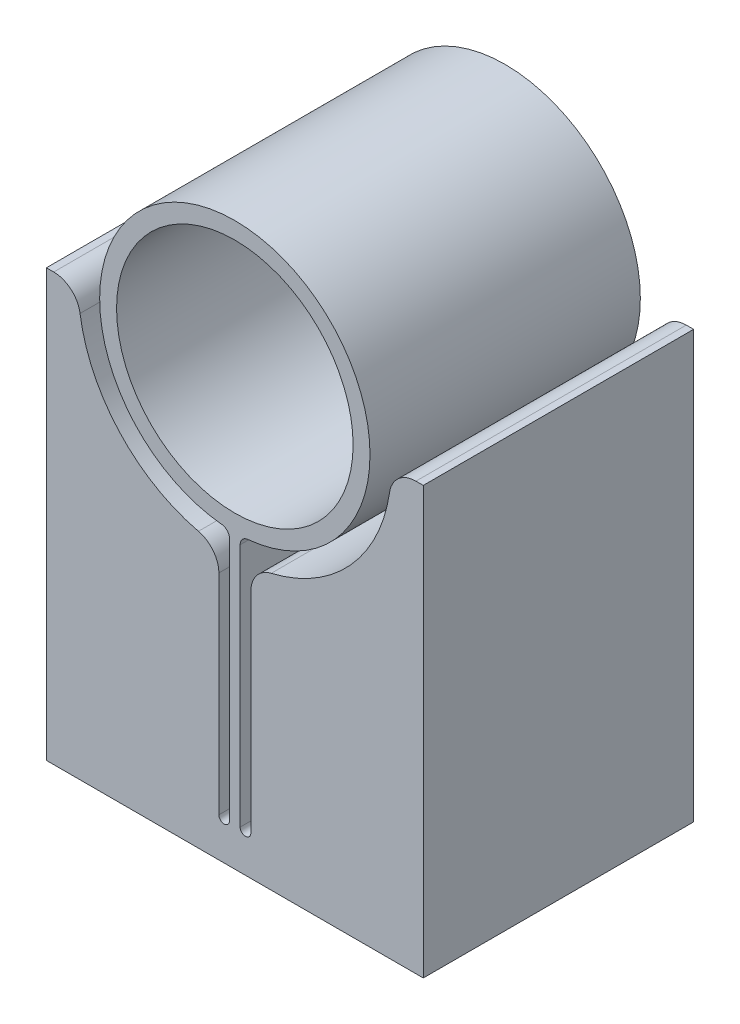
ISO-10303-21;
HEADER;
FILE_DESCRIPTION(('STEP AP214'),'2;1');
FILE_NAME('part.step','',(''),(''),'','','');
FILE_SCHEMA(('AUTOMOTIVE_DESIGN { 1 0 10303 214 1 1 1 1 }'));
ENDSEC;
DATA;
#1=APPLICATION_CONTEXT('core data for automotive mechanical design processes');
#2=APPLICATION_PROTOCOL_DEFINITION('international standard','automotive_design',2000,#1);
#3=PRODUCT_CONTEXT('',#1,'mechanical');
#4=PRODUCT('Part','Part','',(#3));
#5=PRODUCT_RELATED_PRODUCT_CATEGORY('part','',(#4));
#6=PRODUCT_DEFINITION_FORMATION('','',#4);
#7=PRODUCT_DEFINITION_CONTEXT('part definition',#1,'design');
#8=PRODUCT_DEFINITION('design','',#6,#7);
#9=PRODUCT_DEFINITION_SHAPE('','',#8);
#10=(LENGTH_UNIT() NAMED_UNIT(*) SI_UNIT(.MILLI.,.METRE.));
#11=(NAMED_UNIT(*) PLANE_ANGLE_UNIT() SI_UNIT($,.RADIAN.));
#12=(NAMED_UNIT(*) SI_UNIT($,.STERADIAN.) SOLID_ANGLE_UNIT());
#13=UNCERTAINTY_MEASURE_WITH_UNIT(LENGTH_MEASURE(1.E-05),#10,'distance_accuracy_value','');
#14=(GEOMETRIC_REPRESENTATION_CONTEXT(3) GLOBAL_UNCERTAINTY_ASSIGNED_CONTEXT((#13)) GLOBAL_UNIT_ASSIGNED_CONTEXT((#10,
#11,#12)) REPRESENTATION_CONTEXT('',''));
#15=CARTESIAN_POINT('',(0.,0.,0.));
#16=DIRECTION('',(0.,0.,1.));
#17=DIRECTION('',(1.,0.,0.));
#18=AXIS2_PLACEMENT_3D('',#15,#16,#17);
#19=CARTESIAN_POINT('',(0.,-40.0837,-12.7));
#20=DIRECTION('',(0.,-1.,0.));
#21=DIRECTION('',(0.,0.,-1.));
#22=AXIS2_PLACEMENT_3D('',#19,#20,#21);
#23=PLANE('',#22);
#24=CARTESIAN_POINT('',(-12.7,-40.0837,0.));
#25=DIRECTION('',(0.,-1.,0.));
#26=DIRECTION('',(0.,0.,-1.));
#27=AXIS2_PLACEMENT_3D('',#24,#25,#26);
#28=CIRCLE('',#27,2.55269999999999);
#29=CARTESIAN_POINT('',(-12.7,-40.0837,-2.55269999999999));
#30=VERTEX_POINT('',#29);
#31=EDGE_CURVE('E235',#30,#30,#28,.T.);
#32=ORIENTED_EDGE('',*,*,#31,.F.);
#33=EDGE_LOOP('',(#32));
#34=FACE_BOUND('',#33,.T.);
#35=CARTESIAN_POINT('',(12.7,-40.0837,0.));
#36=DIRECTION('',(0.,-1.,0.));
#37=DIRECTION('',(0.,0.,-1.));
#38=AXIS2_PLACEMENT_3D('',#35,#36,#37);
#39=CIRCLE('',#38,2.55269999999999);
#40=CARTESIAN_POINT('',(12.7,-40.0837,-2.55269999999999));
#41=VERTEX_POINT('',#40);
#42=EDGE_CURVE('E241',#41,#41,#39,.T.);
#43=ORIENTED_EDGE('',*,*,#42,.F.);
#44=EDGE_LOOP('',(#43));
#45=FACE_BOUND('',#44,.T.);
#46=DIRECTION('',(1.,0.,0.));
#47=VECTOR('',#46,1.);
#48=CARTESIAN_POINT('',(0.,-40.0837,12.7));
#49=LINE('',#48,#47);
#50=CARTESIAN_POINT('',(-17.705953405,-40.0837,12.7));
#51=VERTEX_POINT('',#50);
#52=CARTESIAN_POINT('',(17.705953405,-40.0837,12.7));
#53=VERTEX_POINT('',#52);
#54=EDGE_CURVE('E244',#51,#53,#49,.T.);
#55=ORIENTED_EDGE('',*,*,#54,.F.);
#56=DIRECTION('',(0.,0.,1.));
#57=VECTOR('',#56,1.);
#58=CARTESIAN_POINT('',(-17.705953405,-40.0837,-12.7));
#59=LINE('',#58,#57);
#60=CARTESIAN_POINT('',(-17.705953405,-40.0837,-12.7));
#61=VERTEX_POINT('',#60);
#62=EDGE_CURVE('E307',#61,#51,#59,.T.);
#63=ORIENTED_EDGE('',*,*,#62,.F.);
#64=DIRECTION('',(1.,0.,0.));
#65=VECTOR('',#64,1.);
#66=CARTESIAN_POINT('',(0.,-40.0837,-12.7));
#67=LINE('',#66,#65);
#68=CARTESIAN_POINT('',(17.705953405,-40.0837,-12.7));
#69=VERTEX_POINT('',#68);
#70=EDGE_CURVE('E245',#61,#69,#67,.T.);
#71=ORIENTED_EDGE('',*,*,#70,.T.);
#72=DIRECTION('',(0.,0.,1.));
#73=VECTOR('',#72,1.);
#74=CARTESIAN_POINT('',(17.705953405,-40.0837,-12.7));
#75=LINE('',#74,#73);
#76=EDGE_CURVE('E278',#69,#53,#75,.T.);
#77=ORIENTED_EDGE('',*,*,#76,.T.);
#78=EDGE_LOOP('',(#55,#63,#71,#77));
#79=FACE_BOUND('',#78,.T.);
#80=ADVANCED_FACE('F43',(#34,#45,#79),#23,.T.);
#81=CARTESIAN_POINT('',(-17.705953405,0.,-12.7));
#82=DIRECTION('',(1.,0.,0.));
#83=DIRECTION('',(0.,0.,-1.));
#84=AXIS2_PLACEMENT_3D('',#81,#82,#83);
#85=PLANE('',#84);
#86=DIRECTION('',(0.,1.,0.));
#87=VECTOR('',#86,1.);
#88=CARTESIAN_POINT('',(-17.705953405,0.,12.7));
#89=LINE('',#88,#87);
#90=CARTESIAN_POINT('',(-17.705953405,0.,12.7));
#91=VERTEX_POINT('',#90);
#92=EDGE_CURVE('E303',#51,#91,#89,.T.);
#93=ORIENTED_EDGE('',*,*,#92,.T.);
#94=DIRECTION('',(0.,0.,1.));
#95=VECTOR('',#94,1.);
#96=CARTESIAN_POINT('',(-17.705953405,0.,-12.7));
#97=LINE('',#96,#95);
#98=CARTESIAN_POINT('',(-17.705953405,0.,-12.7));
#99=VERTEX_POINT('',#98);
#100=EDGE_CURVE('E310',#99,#91,#97,.T.);
#101=ORIENTED_EDGE('',*,*,#100,.F.);
#102=DIRECTION('',(0.,1.,0.));
#103=VECTOR('',#102,1.);
#104=CARTESIAN_POINT('',(-17.705953405,0.,-12.7));
#105=LINE('',#104,#103);
#106=EDGE_CURVE('E273',#61,#99,#105,.T.);
#107=ORIENTED_EDGE('',*,*,#106,.F.);
#108=ORIENTED_EDGE('',*,*,#62,.T.);
#109=EDGE_LOOP('',(#93,#101,#107,#108));
#110=FACE_BOUND('',#109,.T.);
#111=ADVANCED_FACE('F387',(#110),#85,.F.);
#112=CARTESIAN_POINT('',(0.,0.,-12.7));
#113=DIRECTION('',(0.,-1.,0.));
#114=DIRECTION('',(0.,0.,-1.));
#115=AXIS2_PLACEMENT_3D('',#112,#113,#114);
#116=PLANE('',#115);
#117=DIRECTION('',(1.,0.,0.));
#118=VECTOR('',#117,1.);
#119=CARTESIAN_POINT('',(0.,0.,12.7));
#120=LINE('',#119,#118);
#121=CARTESIAN_POINT('',(-17.0173440936005,0.,12.7));
#122=VERTEX_POINT('',#121);
#123=EDGE_CURVE('E300',#91,#122,#120,.T.);
#124=ORIENTED_EDGE('',*,*,#123,.T.);
#125=DIRECTION('',(0.,0.,-1.));
#126=VECTOR('',#125,1.);
#127=CARTESIAN_POINT('',(-17.0173440936005,0.,-12.7));
#128=LINE('',#127,#126);
#129=CARTESIAN_POINT('',(-17.0173440936005,0.,-12.7));
#130=VERTEX_POINT('',#129);
#131=EDGE_CURVE('E345',#122,#130,#128,.T.);
#132=ORIENTED_EDGE('',*,*,#131,.T.);
#133=DIRECTION('',(1.,0.,0.));
#134=VECTOR('',#133,1.);
#135=CARTESIAN_POINT('',(0.,0.,-12.7));
#136=LINE('',#135,#134);
#137=EDGE_CURVE('E270',#99,#130,#136,.T.);
#138=ORIENTED_EDGE('',*,*,#137,.F.);
#139=ORIENTED_EDGE('',*,*,#100,.T.);
#140=EDGE_LOOP('',(#124,#132,#138,#139));
#141=FACE_BOUND('',#140,.T.);
#142=ADVANCED_FACE('F382',(#141),#116,.F.);
#143=CARTESIAN_POINT('',(0.,0.,-12.7));
#144=DIRECTION('',(0.,0.,1.));
#145=DIRECTION('',(1.,0.,0.));
#146=AXIS2_PLACEMENT_3D('',#143,#144,#145);
#147=CYLINDRICAL_SURFACE('',#146,14.7);
#148=CARTESIAN_POINT('',(0.,0.,-12.7));
#149=DIRECTION('',(0.,0.,1.));
#150=DIRECTION('',(1.,0.,0.));
#151=AXIS2_PLACEMENT_3D('',#148,#149,#150);
#152=CIRCLE('',#151,14.7);
#153=CARTESIAN_POINT('',(-3.41860465116279,-14.2969626927907,-12.7));
#154=VERTEX_POINT('',#153);
#155=CARTESIAN_POINT('',(-14.5438929172051,-2.13662790697674,-12.7));
#156=VERTEX_POINT('',#155);
#157=EDGE_CURVE('E267',#154,#156,#152,.F.);
#158=ORIENTED_EDGE('',*,*,#157,.T.);
#159=DIRECTION('',(0.,0.,1.));
#160=VECTOR('',#159,1.);
#161=CARTESIAN_POINT('',(-14.5438929172051,-2.13662790697674,-12.7));
#162=LINE('',#161,#160);
#163=CARTESIAN_POINT('',(-14.5438929172051,-2.13662790697674,12.7));
#164=VERTEX_POINT('',#163);
#165=EDGE_CURVE('E334',#156,#164,#162,.T.);
#166=ORIENTED_EDGE('',*,*,#165,.T.);
#167=CARTESIAN_POINT('',(0.,0.,12.7));
#168=DIRECTION('',(0.,0.,1.));
#169=DIRECTION('',(1.,0.,0.));
#170=AXIS2_PLACEMENT_3D('',#167,#168,#169);
#171=CIRCLE('',#170,14.7);
#172=CARTESIAN_POINT('',(-3.41860465116279,-14.2969626927907,12.7));
#173=VERTEX_POINT('',#172);
#174=EDGE_CURVE('E298',#173,#164,#171,.F.);
#175=ORIENTED_EDGE('',*,*,#174,.F.);
#176=DIRECTION('',(0.,0.,1.));
#177=VECTOR('',#176,1.);
#178=CARTESIAN_POINT('',(-3.41860465116279,-14.2969626927907,-12.7));
#179=LINE('',#178,#177);
#180=EDGE_CURVE('E332',#173,#154,#179,.F.);
#181=ORIENTED_EDGE('',*,*,#180,.T.);
#182=EDGE_LOOP('',(#158,#166,#175,#181));
#183=FACE_BOUND('',#182,.T.);
#184=ADVANCED_FACE('F369',(#183),#147,.F.);
#185=CARTESIAN_POINT('',(-1.5,0.,-12.7));
#186=DIRECTION('',(1.,0.,0.));
#187=DIRECTION('',(0.,1.,0.));
#188=AXIS2_PLACEMENT_3D('',#185,#186,#187);
#189=PLANE('',#188);
#190=DIRECTION('',(0.,1.,0.));
#191=VECTOR('',#190,1.);
#192=CARTESIAN_POINT('',(-1.5,0.,-12.7));
#193=LINE('',#192,#191);
#194=CARTESIAN_POINT('',(-1.5,-36.4087,-12.7));
#195=VERTEX_POINT('',#194);
#196=CARTESIAN_POINT('',(-1.5,-16.7284189330612,-12.7));
#197=VERTEX_POINT('',#196);
#198=EDGE_CURVE('E264',#195,#197,#193,.T.);
#199=ORIENTED_EDGE('',*,*,#198,.T.);
#200=DIRECTION('',(0.,0.,1.));
#201=VECTOR('',#200,1.);
#202=CARTESIAN_POINT('',(-1.5,-16.7284189330612,-12.7));
#203=LINE('',#202,#201);
#204=CARTESIAN_POINT('',(-1.5,-16.7284189330612,12.7));
#205=VERTEX_POINT('',#204);
#206=EDGE_CURVE('E51',#197,#205,#203,.T.);
#207=ORIENTED_EDGE('',*,*,#206,.T.);
#208=DIRECTION('',(0.,1.,0.));
#209=VECTOR('',#208,1.);
#210=CARTESIAN_POINT('',(-1.5,0.,12.7));
#211=LINE('',#210,#209);
#212=CARTESIAN_POINT('',(-1.5,-36.4087,12.7));
#213=VERTEX_POINT('',#212);
#214=EDGE_CURVE('E199',#213,#205,#211,.T.);
#215=ORIENTED_EDGE('',*,*,#214,.F.);
#216=DIRECTION('',(0.,0.,-1.));
#217=VECTOR('',#216,1.);
#218=CARTESIAN_POINT('',(-1.5,-36.4087,12.7));
#219=LINE('',#218,#217);
#220=EDGE_CURVE('E210',#213,#195,#219,.T.);
#221=ORIENTED_EDGE('',*,*,#220,.T.);
#222=EDGE_LOOP('',(#199,#207,#215,#221));
#223=FACE_BOUND('',#222,.T.);
#224=ADVANCED_FACE('F363',(#223),#189,.T.);
#225=CARTESIAN_POINT('',(-0.5,0.,-12.7));
#226=DIRECTION('',(-1.,0.,0.));
#227=DIRECTION('',(0.,-1.,0.));
#228=AXIS2_PLACEMENT_3D('',#225,#226,#227);
#229=PLANE('',#228);
#230=DIRECTION('',(0.,0.,-1.));
#231=VECTOR('',#230,1.);
#232=CARTESIAN_POINT('',(-0.500000000000002,-36.4087,12.7));
#233=LINE('',#232,#231);
#234=CARTESIAN_POINT('',(-0.500000000000002,-36.4087,12.7));
#235=VERTEX_POINT('',#234);
#236=CARTESIAN_POINT('',(-0.500000000000002,-36.4087,-12.7));
#237=VERTEX_POINT('',#236);
#238=EDGE_CURVE('E203',#235,#237,#233,.T.);
#239=ORIENTED_EDGE('',*,*,#238,.F.);
#240=DIRECTION('',(0.,-1.,0.));
#241=VECTOR('',#240,1.);
#242=CARTESIAN_POINT('',(-0.5,0.,12.7));
#243=LINE('',#242,#241);
#244=CARTESIAN_POINT('',(-0.5,-13.4315859078517,12.7));
#245=VERTEX_POINT('',#244);
#246=EDGE_CURVE('E187',#245,#235,#243,.T.);
#247=ORIENTED_EDGE('',*,*,#246,.F.);
#248=DIRECTION('',(0.,0.,1.));
#249=VECTOR('',#248,1.);
#250=CARTESIAN_POINT('',(-0.5,-13.4315859078517,-12.7));
#251=LINE('',#250,#249);
#252=CARTESIAN_POINT('',(-0.5,-13.4315859078517,-12.7));
#253=VERTEX_POINT('',#252);
#254=EDGE_CURVE('E323',#245,#253,#251,.F.);
#255=ORIENTED_EDGE('',*,*,#254,.T.);
#256=DIRECTION('',(0.,-1.,0.));
#257=VECTOR('',#256,1.);
#258=CARTESIAN_POINT('',(-0.5,0.,-12.7));
#259=LINE('',#258,#257);
#260=EDGE_CURVE('E206',#253,#237,#259,.T.);
#261=ORIENTED_EDGE('',*,*,#260,.T.);
#262=EDGE_LOOP('',(#239,#247,#255,#261));
#263=FACE_BOUND('',#262,.T.);
#264=ADVANCED_FACE('F204',(#263),#229,.T.);
#265=CARTESIAN_POINT('',(0.,0.,-12.7));
#266=DIRECTION('',(0.,0.,1.));
#267=DIRECTION('',(1.,0.,0.));
#268=AXIS2_PLACEMENT_3D('',#265,#266,#267);
#269=CYLINDRICAL_SURFACE('',#268,12.7);
#270=CARTESIAN_POINT('',(0.,0.,12.7));
#271=DIRECTION('',(0.,0.,1.));
#272=DIRECTION('',(1.,0.,0.));
#273=AXIS2_PLACEMENT_3D('',#270,#271,#272);
#274=CIRCLE('',#273,12.7);
#275=CARTESIAN_POINT('',(-1.21764705882353,-12.6414926191545,12.7));
#276=VERTEX_POINT('',#275);
#277=CARTESIAN_POINT('',(1.21764705882353,-12.6414926191545,12.7));
#278=VERTEX_POINT('',#277);
#279=EDGE_CURVE('E200',#276,#278,#274,.F.);
#280=ORIENTED_EDGE('',*,*,#279,.T.);
#281=DIRECTION('',(0.,0.,1.));
#282=VECTOR('',#281,1.);
#283=CARTESIAN_POINT('',(1.21764705882353,-12.6414926191545,-12.7));
#284=LINE('',#283,#282);
#285=CARTESIAN_POINT('',(1.21764705882353,-12.6414926191545,-12.7));
#286=VERTEX_POINT('',#285);
#287=EDGE_CURVE('E321',#278,#286,#284,.F.);
#288=ORIENTED_EDGE('',*,*,#287,.T.);
#289=CARTESIAN_POINT('',(0.,0.,-12.7));
#290=DIRECTION('',(0.,0.,1.));
#291=DIRECTION('',(1.,0.,0.));
#292=AXIS2_PLACEMENT_3D('',#289,#290,#291);
#293=CIRCLE('',#292,12.7);
#294=CARTESIAN_POINT('',(-1.21764705882353,-12.6414926191545,-12.7));
#295=VERTEX_POINT('',#294);
#296=EDGE_CURVE('E260',#295,#286,#293,.F.);
#297=ORIENTED_EDGE('',*,*,#296,.F.);
#298=DIRECTION('',(0.,0.,1.));
#299=VECTOR('',#298,1.);
#300=CARTESIAN_POINT('',(-1.21764705882353,-12.6414926191545,-12.7));
#301=LINE('',#300,#299);
#302=EDGE_CURVE('E318',#295,#276,#301,.T.);
#303=ORIENTED_EDGE('',*,*,#302,.T.);
#304=EDGE_LOOP('',(#280,#288,#297,#303));
#305=FACE_BOUND('',#304,.T.);
#306=ADVANCED_FACE('F502',(#305),#269,.T.);
#307=CARTESIAN_POINT('',(0.5,0.,-12.7));
#308=DIRECTION('',(-1.,0.,0.));
#309=DIRECTION('',(0.,-1.,0.));
#310=AXIS2_PLACEMENT_3D('',#307,#308,#309);
#311=PLANE('',#310);
#312=DIRECTION('',(0.,0.,-1.));
#313=VECTOR('',#312,1.);
#314=CARTESIAN_POINT('',(0.500000000000002,-36.4087,12.7));
#315=LINE('',#314,#313);
#316=CARTESIAN_POINT('',(0.500000000000002,-36.4087,12.7));
#317=VERTEX_POINT('',#316);
#318=CARTESIAN_POINT('',(0.500000000000002,-36.4087,-12.7));
#319=VERTEX_POINT('',#318);
#320=EDGE_CURVE('E217',#317,#319,#315,.T.);
#321=ORIENTED_EDGE('',*,*,#320,.T.);
#322=DIRECTION('',(0.,-1.,0.));
#323=VECTOR('',#322,1.);
#324=CARTESIAN_POINT('',(0.5,0.,-12.7));
#325=LINE('',#324,#323);
#326=CARTESIAN_POINT('',(0.5,-13.4315859078517,-12.7));
#327=VERTEX_POINT('',#326);
#328=EDGE_CURVE('E258',#327,#319,#325,.T.);
#329=ORIENTED_EDGE('',*,*,#328,.F.);
#330=DIRECTION('',(0.,0.,-1.));
#331=VECTOR('',#330,1.);
#332=CARTESIAN_POINT('',(0.5,-13.4315859078517,12.7));
#333=LINE('',#332,#331);
#334=CARTESIAN_POINT('',(0.5,-13.4315859078517,12.7));
#335=VERTEX_POINT('',#334);
#336=EDGE_CURVE('E309',#327,#335,#333,.F.);
#337=ORIENTED_EDGE('',*,*,#336,.T.);
#338=DIRECTION('',(0.,-1.,0.));
#339=VECTOR('',#338,1.);
#340=CARTESIAN_POINT('',(0.5,0.,12.7));
#341=LINE('',#340,#339);
#342=EDGE_CURVE('E293',#335,#317,#341,.T.);
#343=ORIENTED_EDGE('',*,*,#342,.T.);
#344=EDGE_LOOP('',(#321,#329,#337,#343));
#345=FACE_BOUND('',#344,.T.);
#346=ADVANCED_FACE('F489',(#345),#311,.F.);
#347=CARTESIAN_POINT('',(1.5,0.,-12.7));
#348=DIRECTION('',(1.,0.,0.));
#349=DIRECTION('',(0.,1.,0.));
#350=AXIS2_PLACEMENT_3D('',#347,#348,#349);
#351=PLANE('',#350);
#352=DIRECTION('',(0.,1.,0.));
#353=VECTOR('',#352,1.);
#354=CARTESIAN_POINT('',(1.5,0.,12.7));
#355=LINE('',#354,#353);
#356=CARTESIAN_POINT('',(1.49999999999999,-36.4087,12.7));
#357=VERTEX_POINT('',#356);
#358=CARTESIAN_POINT('',(1.5,-16.7284189330612,12.7));
#359=VERTEX_POINT('',#358);
#360=EDGE_CURVE('E290',#357,#359,#355,.T.);
#361=ORIENTED_EDGE('',*,*,#360,.T.);
#362=DIRECTION('',(0.,0.,-1.));
#363=VECTOR('',#362,1.);
#364=CARTESIAN_POINT('',(1.5,-16.7284189330612,-12.7));
#365=LINE('',#364,#363);
#366=CARTESIAN_POINT('',(1.5,-16.7284189330612,-12.7));
#367=VERTEX_POINT('',#366);
#368=EDGE_CURVE('E11',#359,#367,#365,.T.);
#369=ORIENTED_EDGE('',*,*,#368,.T.);
#370=DIRECTION('',(0.,1.,0.));
#371=VECTOR('',#370,1.);
#372=CARTESIAN_POINT('',(1.5,0.,-12.7));
#373=LINE('',#372,#371);
#374=CARTESIAN_POINT('',(1.49999999999999,-36.4087,-12.7));
#375=VERTEX_POINT('',#374);
#376=EDGE_CURVE('E256',#375,#367,#373,.T.);
#377=ORIENTED_EDGE('',*,*,#376,.F.);
#378=DIRECTION('',(0.,0.,-1.));
#379=VECTOR('',#378,1.);
#380=CARTESIAN_POINT('',(1.49999999999999,-36.4087,12.7));
#381=LINE('',#380,#379);
#382=EDGE_CURVE('E225',#357,#375,#381,.T.);
#383=ORIENTED_EDGE('',*,*,#382,.F.);
#384=EDGE_LOOP('',(#361,#369,#377,#383));
#385=FACE_BOUND('',#384,.T.);
#386=ADVANCED_FACE('F410',(#385),#351,.F.);
#387=CARTESIAN_POINT('',(0.,0.,-12.7));
#388=DIRECTION('',(0.,0.,1.));
#389=DIRECTION('',(1.,0.,0.));
#390=AXIS2_PLACEMENT_3D('',#387,#388,#389);
#391=CYLINDRICAL_SURFACE('',#390,14.7);
#392=CARTESIAN_POINT('',(0.,0.,12.7));
#393=DIRECTION('',(0.,0.,1.));
#394=DIRECTION('',(1.,0.,0.));
#395=AXIS2_PLACEMENT_3D('',#392,#393,#394);
#396=CIRCLE('',#395,14.7);
#397=CARTESIAN_POINT('',(14.5438929172051,-2.13662790697674,12.7));
#398=VERTEX_POINT('',#397);
#399=CARTESIAN_POINT('',(3.41860465116279,-14.2969626927907,12.7));
#400=VERTEX_POINT('',#399);
#401=EDGE_CURVE('E287',#398,#400,#396,.F.);
#402=ORIENTED_EDGE('',*,*,#401,.F.);
#403=DIRECTION('',(0.,0.,1.));
#404=VECTOR('',#403,1.);
#405=CARTESIAN_POINT('',(14.5438929172051,-2.13662790697674,-12.7));
#406=LINE('',#405,#404);
#407=CARTESIAN_POINT('',(14.5438929172051,-2.13662790697674,-12.7));
#408=VERTEX_POINT('',#407);
#409=EDGE_CURVE('E359',#398,#408,#406,.F.);
#410=ORIENTED_EDGE('',*,*,#409,.T.);
#411=CARTESIAN_POINT('',(0.,0.,-12.7));
#412=DIRECTION('',(0.,0.,1.));
#413=DIRECTION('',(1.,0.,0.));
#414=AXIS2_PLACEMENT_3D('',#411,#412,#413);
#415=CIRCLE('',#414,14.7);
#416=CARTESIAN_POINT('',(3.41860465116279,-14.2969626927907,-12.7));
#417=VERTEX_POINT('',#416);
#418=EDGE_CURVE('E254',#408,#417,#415,.F.);
#419=ORIENTED_EDGE('',*,*,#418,.T.);
#420=DIRECTION('',(0.,0.,1.));
#421=VECTOR('',#420,1.);
#422=CARTESIAN_POINT('',(3.41860465116279,-14.2969626927907,-12.7));
#423=LINE('',#422,#421);
#424=EDGE_CURVE('E356',#417,#400,#423,.T.);
#425=ORIENTED_EDGE('',*,*,#424,.T.);
#426=EDGE_LOOP('',(#402,#410,#419,#425));
#427=FACE_BOUND('',#426,.T.);
#428=ADVANCED_FACE('F404',(#427),#391,.F.);
#429=CARTESIAN_POINT('',(0.,0.,-12.7));
#430=DIRECTION('',(0.,1.,0.));
#431=DIRECTION('',(0.,0.,1.));
#432=AXIS2_PLACEMENT_3D('',#429,#430,#431);
#433=PLANE('',#432);
#434=DIRECTION('',(-1.,0.,0.));
#435=VECTOR('',#434,1.);
#436=CARTESIAN_POINT('',(0.,0.,-12.7));
#437=LINE('',#436,#435);
#438=CARTESIAN_POINT('',(17.705953405,0.,-12.7));
#439=VERTEX_POINT('',#438);
#440=CARTESIAN_POINT('',(17.0173440936005,0.,-12.7));
#441=VERTEX_POINT('',#440);
#442=EDGE_CURVE('E252',#439,#441,#437,.T.);
#443=ORIENTED_EDGE('',*,*,#442,.T.);
#444=DIRECTION('',(0.,0.,1.));
#445=VECTOR('',#444,1.);
#446=CARTESIAN_POINT('',(17.0173440936005,0.,-12.7));
#447=LINE('',#446,#445);
#448=CARTESIAN_POINT('',(17.0173440936005,0.,12.7));
#449=VERTEX_POINT('',#448);
#450=EDGE_CURVE('E353',#441,#449,#447,.T.);
#451=ORIENTED_EDGE('',*,*,#450,.T.);
#452=DIRECTION('',(-1.,0.,0.));
#453=VECTOR('',#452,1.);
#454=CARTESIAN_POINT('',(0.,0.,12.7));
#455=LINE('',#454,#453);
#456=CARTESIAN_POINT('',(17.705953405,0.,12.7));
#457=VERTEX_POINT('',#456);
#458=EDGE_CURVE('E284',#457,#449,#455,.T.);
#459=ORIENTED_EDGE('',*,*,#458,.F.);
#460=DIRECTION('',(0.,0.,1.));
#461=VECTOR('',#460,1.);
#462=CARTESIAN_POINT('',(17.705953405,0.,-12.7));
#463=LINE('',#462,#461);
#464=EDGE_CURVE('E313',#439,#457,#463,.T.);
#465=ORIENTED_EDGE('',*,*,#464,.F.);
#466=EDGE_LOOP('',(#443,#451,#459,#465));
#467=FACE_BOUND('',#466,.T.);
#468=ADVANCED_FACE('F398',(#467),#433,.T.);
#469=CARTESIAN_POINT('',(17.705953405,0.,-12.7));
#470=DIRECTION('',(1.,0.,0.));
#471=DIRECTION('',(0.,0.,-1.));
#472=AXIS2_PLACEMENT_3D('',#469,#470,#471);
#473=PLANE('',#472);
#474=DIRECTION('',(0.,1.,0.));
#475=VECTOR('',#474,1.);
#476=CARTESIAN_POINT('',(17.705953405,0.,12.7));
#477=LINE('',#476,#475);
#478=EDGE_CURVE('E281',#53,#457,#477,.T.);
#479=ORIENTED_EDGE('',*,*,#478,.F.);
#480=ORIENTED_EDGE('',*,*,#76,.F.);
#481=DIRECTION('',(0.,1.,0.));
#482=VECTOR('',#481,1.);
#483=CARTESIAN_POINT('',(17.705953405,0.,-12.7));
#484=LINE('',#483,#482);
#485=EDGE_CURVE('E248',#69,#439,#484,.T.);
#486=ORIENTED_EDGE('',*,*,#485,.T.);
#487=ORIENTED_EDGE('',*,*,#464,.T.);
#488=EDGE_LOOP('',(#479,#480,#486,#487));
#489=FACE_BOUND('',#488,.T.);
#490=ADVANCED_FACE('F394',(#489),#473,.T.);
#491=CARTESIAN_POINT('',(0.,0.,-12.7));
#492=DIRECTION('',(0.,0.,1.));
#493=DIRECTION('',(1.,0.,0.));
#494=AXIS2_PLACEMENT_3D('',#491,#492,#493);
#495=CYLINDRICAL_SURFACE('',#494,11.1125);
#496=CARTESIAN_POINT('',(0.,0.,-12.7));
#497=DIRECTION('',(0.,0.,1.));
#498=DIRECTION('',(1.,0.,0.));
#499=AXIS2_PLACEMENT_3D('',#496,#497,#498);
#500=CIRCLE('',#499,11.1125);
#501=CARTESIAN_POINT('',(11.1125,0.,-12.7));
#502=VERTEX_POINT('',#501);
#503=EDGE_CURVE('E275',#502,#502,#500,.F.);
#504=ORIENTED_EDGE('',*,*,#503,.T.);
#505=EDGE_LOOP('',(#504));
#506=FACE_BOUND('',#505,.T.);
#507=CARTESIAN_POINT('',(0.,0.,12.7));
#508=DIRECTION('',(0.,0.,1.));
#509=DIRECTION('',(1.,0.,0.));
#510=AXIS2_PLACEMENT_3D('',#507,#508,#509);
#511=CIRCLE('',#510,11.1125);
#512=CARTESIAN_POINT('',(11.1125,0.,12.7));
#513=VERTEX_POINT('',#512);
#514=EDGE_CURVE('E249',#513,#513,#511,.F.);
#515=ORIENTED_EDGE('',*,*,#514,.F.);
#516=EDGE_LOOP('',(#515));
#517=FACE_BOUND('',#516,.T.);
#518=ADVANCED_FACE('F592',(#506,#517),#495,.F.);
#519=CARTESIAN_POINT('',(0.,0.,-12.7));
#520=DIRECTION('',(0.,0.,1.));
#521=DIRECTION('',(1.,0.,0.));
#522=AXIS2_PLACEMENT_3D('',#519,#520,#521);
#523=PLANE('',#522);
#524=ORIENTED_EDGE('',*,*,#137,.T.);
#525=CARTESIAN_POINT('',(-17.0173440936005,-2.5,-12.7));
#526=DIRECTION('',(0.,0.,1.));
#527=DIRECTION('',(1.,0.,0.));
#528=AXIS2_PLACEMENT_3D('',#525,#526,#527);
#529=CIRCLE('',#528,2.5);
#530=EDGE_CURVE('E351',#130,#156,#529,.F.);
#531=ORIENTED_EDGE('',*,*,#530,.T.);
#532=ORIENTED_EDGE('',*,*,#157,.F.);
#533=CARTESIAN_POINT('',(-4.,-16.7284189330612,-12.7));
#534=DIRECTION('',(0.,0.,1.));
#535=DIRECTION('',(1.,0.,0.));
#536=AXIS2_PLACEMENT_3D('',#533,#534,#535);
#537=CIRCLE('',#536,2.5);
#538=EDGE_CURVE('E348',#154,#197,#537,.F.);
#539=ORIENTED_EDGE('',*,*,#538,.T.);
#540=ORIENTED_EDGE('',*,*,#198,.F.);
#541=CARTESIAN_POINT('',(-1.,-36.4087,-12.7));
#542=DIRECTION('',(0.,0.,-1.));
#543=DIRECTION('',(-1.,0.,0.));
#544=AXIS2_PLACEMENT_3D('',#541,#542,#543);
#545=CIRCLE('',#544,0.499999999999999);
#546=EDGE_CURVE('E215',#237,#195,#545,.T.);
#547=ORIENTED_EDGE('',*,*,#546,.F.);
#548=ORIENTED_EDGE('',*,*,#260,.F.);
#549=CARTESIAN_POINT('',(-1.29375,-13.4315859078517,-12.7));
#550=DIRECTION('',(0.,0.,1.));
#551=DIRECTION('',(1.,0.,0.));
#552=AXIS2_PLACEMENT_3D('',#549,#550,#551);
#553=CIRCLE('',#552,0.79375);
#554=EDGE_CURVE('E330',#253,#295,#553,.T.);
#555=ORIENTED_EDGE('',*,*,#554,.T.);
#556=ORIENTED_EDGE('',*,*,#296,.T.);
#557=CARTESIAN_POINT('',(1.29375,-13.4315859078517,-12.7));
#558=DIRECTION('',(0.,0.,1.));
#559=DIRECTION('',(1.,0.,0.));
#560=AXIS2_PLACEMENT_3D('',#557,#558,#559);
#561=CIRCLE('',#560,0.79375);
#562=EDGE_CURVE('E327',#286,#327,#561,.T.);
#563=ORIENTED_EDGE('',*,*,#562,.T.);
#564=ORIENTED_EDGE('',*,*,#328,.T.);
#565=CARTESIAN_POINT('',(0.999999999999992,-36.4087,-12.7));
#566=DIRECTION('',(0.,0.,-1.));
#567=DIRECTION('',(1.,0.,0.));
#568=AXIS2_PLACEMENT_3D('',#565,#566,#567);
#569=CIRCLE('',#568,0.499999999999999);
#570=EDGE_CURVE('E226',#375,#319,#569,.T.);
#571=ORIENTED_EDGE('',*,*,#570,.F.);
#572=ORIENTED_EDGE('',*,*,#376,.T.);
#573=CARTESIAN_POINT('',(4.,-16.7284189330612,-12.7));
#574=DIRECTION('',(0.,0.,1.));
#575=DIRECTION('',(1.,0.,0.));
#576=AXIS2_PLACEMENT_3D('',#573,#574,#575);
#577=CIRCLE('',#576,2.5);
#578=EDGE_CURVE('E64',#367,#417,#577,.F.);
#579=ORIENTED_EDGE('',*,*,#578,.T.);
#580=ORIENTED_EDGE('',*,*,#418,.F.);
#581=CARTESIAN_POINT('',(17.0173440936005,-2.5,-12.7));
#582=DIRECTION('',(0.,0.,1.));
#583=DIRECTION('',(1.,0.,0.));
#584=AXIS2_PLACEMENT_3D('',#581,#582,#583);
#585=CIRCLE('',#584,2.5);
#586=EDGE_CURVE('E58',#408,#441,#585,.F.);
#587=ORIENTED_EDGE('',*,*,#586,.T.);
#588=ORIENTED_EDGE('',*,*,#442,.F.);
#589=ORIENTED_EDGE('',*,*,#485,.F.);
#590=ORIENTED_EDGE('',*,*,#70,.F.);
#591=ORIENTED_EDGE('',*,*,#106,.T.);
#592=EDGE_LOOP('',(#524,#531,#532,#539,#540,#547,#548,#555,#556,#563,#564,#571,#572,#579,#580,
#587,#588,#589,#590,#591));
#593=FACE_BOUND('',#592,.T.);
#594=ORIENTED_EDGE('',*,*,#503,.F.);
#595=EDGE_LOOP('',(#594));
#596=FACE_BOUND('',#595,.T.);
#597=ADVANCED_FACE('F373',(#593,#596),#523,.F.);
#598=CARTESIAN_POINT('',(0.,0.,12.7));
#599=DIRECTION('',(0.,0.,1.));
#600=DIRECTION('',(1.,0.,0.));
#601=AXIS2_PLACEMENT_3D('',#598,#599,#600);
#602=PLANE('',#601);
#603=ORIENTED_EDGE('',*,*,#174,.T.);
#604=CARTESIAN_POINT('',(-17.0173440936005,-2.5,12.7));
#605=DIRECTION('',(0.,0.,1.));
#606=DIRECTION('',(1.,0.,0.));
#607=AXIS2_PLACEMENT_3D('',#604,#605,#606);
#608=CIRCLE('',#607,2.5);
#609=EDGE_CURVE('E343',#164,#122,#608,.T.);
#610=ORIENTED_EDGE('',*,*,#609,.T.);
#611=ORIENTED_EDGE('',*,*,#123,.F.);
#612=ORIENTED_EDGE('',*,*,#92,.F.);
#613=ORIENTED_EDGE('',*,*,#54,.T.);
#614=ORIENTED_EDGE('',*,*,#478,.T.);
#615=ORIENTED_EDGE('',*,*,#458,.T.);
#616=CARTESIAN_POINT('',(17.0173440936005,-2.5,12.7));
#617=DIRECTION('',(0.,0.,1.));
#618=DIRECTION('',(1.,0.,0.));
#619=AXIS2_PLACEMENT_3D('',#616,#617,#618);
#620=CIRCLE('',#619,2.5);
#621=EDGE_CURVE('E341',#449,#398,#620,.T.);
#622=ORIENTED_EDGE('',*,*,#621,.T.);
#623=ORIENTED_EDGE('',*,*,#401,.T.);
#624=CARTESIAN_POINT('',(4.,-16.7284189330612,12.7));
#625=DIRECTION('',(0.,0.,1.));
#626=DIRECTION('',(1.,0.,0.));
#627=AXIS2_PLACEMENT_3D('',#624,#625,#626);
#628=CIRCLE('',#627,2.5);
#629=EDGE_CURVE('E337',#400,#359,#628,.T.);
#630=ORIENTED_EDGE('',*,*,#629,.T.);
#631=ORIENTED_EDGE('',*,*,#360,.F.);
#632=CARTESIAN_POINT('',(0.999999999999992,-36.4087,12.7));
#633=DIRECTION('',(0.,0.,-1.));
#634=DIRECTION('',(1.,0.,0.));
#635=AXIS2_PLACEMENT_3D('',#632,#633,#634);
#636=CIRCLE('',#635,0.499999999999999);
#637=EDGE_CURVE('E222',#357,#317,#636,.T.);
#638=ORIENTED_EDGE('',*,*,#637,.T.);
#639=ORIENTED_EDGE('',*,*,#342,.F.);
#640=CARTESIAN_POINT('',(1.29375,-13.4315859078517,12.7));
#641=DIRECTION('',(0.,0.,1.));
#642=DIRECTION('',(1.,0.,0.));
#643=AXIS2_PLACEMENT_3D('',#640,#641,#642);
#644=CIRCLE('',#643,0.79375);
#645=EDGE_CURVE('E325',#335,#278,#644,.F.);
#646=ORIENTED_EDGE('',*,*,#645,.T.);
#647=ORIENTED_EDGE('',*,*,#279,.F.);
#648=CARTESIAN_POINT('',(-1.29375,-13.4315859078517,12.7));
#649=DIRECTION('',(0.,0.,1.));
#650=DIRECTION('',(1.,0.,0.));
#651=AXIS2_PLACEMENT_3D('',#648,#649,#650);
#652=CIRCLE('',#651,0.79375);
#653=EDGE_CURVE('E196',#276,#245,#652,.F.);
#654=ORIENTED_EDGE('',*,*,#653,.T.);
#655=ORIENTED_EDGE('',*,*,#246,.T.);
#656=CARTESIAN_POINT('',(-1.,-36.4087,12.7));
#657=DIRECTION('',(0.,0.,-1.));
#658=DIRECTION('',(-1.,0.,0.));
#659=AXIS2_PLACEMENT_3D('',#656,#657,#658);
#660=CIRCLE('',#659,0.499999999999999);
#661=EDGE_CURVE('E194',#235,#213,#660,.T.);
#662=ORIENTED_EDGE('',*,*,#661,.T.);
#663=ORIENTED_EDGE('',*,*,#214,.T.);
#664=CARTESIAN_POINT('',(-4.,-16.7284189330612,12.7));
#665=DIRECTION('',(0.,0.,1.));
#666=DIRECTION('',(1.,0.,0.));
#667=AXIS2_PLACEMENT_3D('',#664,#665,#666);
#668=CIRCLE('',#667,2.5);
#669=EDGE_CURVE('E339',#205,#173,#668,.T.);
#670=ORIENTED_EDGE('',*,*,#669,.T.);
#671=EDGE_LOOP('',(#603,#610,#611,#612,#613,#614,#615,#622,#623,#630,#631,#638,#639,#646,#647,
#654,#655,#662,#663,#670));
#672=FACE_BOUND('',#671,.T.);
#673=ORIENTED_EDGE('',*,*,#514,.T.);
#674=EDGE_LOOP('',(#673));
#675=FACE_BOUND('',#674,.T.);
#676=ADVANCED_FACE('F190',(#672,#675),#602,.T.);
#677=CARTESIAN_POINT('',(1.29375,-13.4315859078517,-12.7));
#678=DIRECTION('',(0.,0.,1.));
#679=DIRECTION('',(1.,0.,0.));
#680=AXIS2_PLACEMENT_3D('',#677,#678,#679);
#681=CYLINDRICAL_SURFACE('',#680,0.79375);
#682=ORIENTED_EDGE('',*,*,#562,.F.);
#683=ORIENTED_EDGE('',*,*,#287,.F.);
#684=ORIENTED_EDGE('',*,*,#645,.F.);
#685=ORIENTED_EDGE('',*,*,#336,.F.);
#686=EDGE_LOOP('',(#682,#683,#684,#685));
#687=FACE_BOUND('',#686,.T.);
#688=ADVANCED_FACE('F428',(#687),#681,.F.);
#689=CARTESIAN_POINT('',(-1.29375,-13.4315859078517,-12.7));
#690=DIRECTION('',(0.,0.,1.));
#691=DIRECTION('',(1.,0.,0.));
#692=AXIS2_PLACEMENT_3D('',#689,#690,#691);
#693=CYLINDRICAL_SURFACE('',#692,0.79375);
#694=ORIENTED_EDGE('',*,*,#554,.F.);
#695=ORIENTED_EDGE('',*,*,#254,.F.);
#696=ORIENTED_EDGE('',*,*,#653,.F.);
#697=ORIENTED_EDGE('',*,*,#302,.F.);
#698=EDGE_LOOP('',(#694,#695,#696,#697));
#699=FACE_BOUND('',#698,.T.);
#700=ADVANCED_FACE('F431',(#699),#693,.F.);
#701=CARTESIAN_POINT('',(12.7,-40.0837,0.));
#702=DIRECTION('',(0.,-1.,0.));
#703=DIRECTION('',(0.,0.,-1.));
#704=AXIS2_PLACEMENT_3D('',#701,#702,#703);
#705=CYLINDRICAL_SURFACE('',#704,2.55269999999999);
#706=CARTESIAN_POINT('',(12.7,-21.0337,0.));
#707=DIRECTION('',(0.,-1.,0.));
#708=DIRECTION('',(0.,0.,-1.));
#709=AXIS2_PLACEMENT_3D('',#706,#707,#708);
#710=CIRCLE('',#709,2.55269999999999);
#711=CARTESIAN_POINT('',(12.7,-21.0337,-2.55269999999999));
#712=VERTEX_POINT('',#711);
#713=EDGE_CURVE('E238',#712,#712,#710,.T.);
#714=ORIENTED_EDGE('',*,*,#713,.F.);
#715=EDGE_LOOP('',(#714));
#716=FACE_BOUND('',#715,.T.);
#717=ORIENTED_EDGE('',*,*,#42,.T.);
#718=EDGE_LOOP('',(#717));
#719=FACE_BOUND('',#718,.T.);
#720=ADVANCED_FACE('F435',(#716,#719),#705,.F.);
#721=CARTESIAN_POINT('',(12.7,-21.0337,0.));
#722=DIRECTION('',(0.,-1.,0.));
#723=DIRECTION('',(0.,0.,-1.));
#724=AXIS2_PLACEMENT_3D('',#721,#722,#723);
#725=CONICAL_SURFACE('',#724,2.55269999999999,1.02974425867665);
#726=CARTESIAN_POINT('',(12.7,-19.4998830978083,0.));
#727=VERTEX_POINT('',#726);
#728=VERTEX_LOOP('',#727);
#729=FACE_BOUND('',#728,.T.);
#730=ORIENTED_EDGE('',*,*,#713,.T.);
#731=EDGE_LOOP('',(#730));
#732=FACE_BOUND('',#731,.T.);
#733=ADVANCED_FACE('F544',(#729,#732),#725,.F.);
#734=CARTESIAN_POINT('',(-12.7,-40.0837,0.));
#735=DIRECTION('',(0.,-1.,0.));
#736=DIRECTION('',(0.,0.,-1.));
#737=AXIS2_PLACEMENT_3D('',#734,#735,#736);
#738=CYLINDRICAL_SURFACE('',#737,2.55269999999999);
#739=CARTESIAN_POINT('',(-12.7,-21.0337,0.));
#740=DIRECTION('',(0.,-1.,0.));
#741=DIRECTION('',(0.,0.,-1.));
#742=AXIS2_PLACEMENT_3D('',#739,#740,#741);
#743=CIRCLE('',#742,2.55269999999999);
#744=CARTESIAN_POINT('',(-12.7,-21.0337,-2.55269999999999));
#745=VERTEX_POINT('',#744);
#746=EDGE_CURVE('E220',#745,#745,#743,.T.);
#747=ORIENTED_EDGE('',*,*,#746,.F.);
#748=EDGE_LOOP('',(#747));
#749=FACE_BOUND('',#748,.T.);
#750=ORIENTED_EDGE('',*,*,#31,.T.);
#751=EDGE_LOOP('',(#750));
#752=FACE_BOUND('',#751,.T.);
#753=ADVANCED_FACE('F535',(#749,#752),#738,.F.);
#754=CARTESIAN_POINT('',(-12.7,-21.0337,0.));
#755=DIRECTION('',(0.,-1.,0.));
#756=DIRECTION('',(0.,0.,-1.));
#757=AXIS2_PLACEMENT_3D('',#754,#755,#756);
#758=CONICAL_SURFACE('',#757,2.55269999999999,1.02974425867665);
#759=CARTESIAN_POINT('',(-12.7,-19.4998830978083,0.));
#760=VERTEX_POINT('',#759);
#761=VERTEX_LOOP('',#760);
#762=FACE_BOUND('',#761,.T.);
#763=ORIENTED_EDGE('',*,*,#746,.T.);
#764=EDGE_LOOP('',(#763));
#765=FACE_BOUND('',#764,.T.);
#766=ADVANCED_FACE('F479',(#762,#765),#758,.F.);
#767=CARTESIAN_POINT('',(-1.,-36.4087,12.7));
#768=DIRECTION('',(0.,0.,-1.));
#769=DIRECTION('',(-1.,0.,0.));
#770=AXIS2_PLACEMENT_3D('',#767,#768,#769);
#771=CYLINDRICAL_SURFACE('',#770,0.499999999999999);
#772=ORIENTED_EDGE('',*,*,#546,.T.);
#773=ORIENTED_EDGE('',*,*,#220,.F.);
#774=ORIENTED_EDGE('',*,*,#661,.F.);
#775=ORIENTED_EDGE('',*,*,#238,.T.);
#776=EDGE_LOOP('',(#772,#773,#774,#775));
#777=FACE_BOUND('',#776,.T.);
#778=ADVANCED_FACE('F213',(#777),#771,.F.);
#779=CARTESIAN_POINT('',(0.999999999999992,-36.4087,12.7));
#780=DIRECTION('',(0.,0.,-1.));
#781=DIRECTION('',(-1.,0.,0.));
#782=AXIS2_PLACEMENT_3D('',#779,#780,#781);
#783=CYLINDRICAL_SURFACE('',#782,0.499999999999999);
#784=ORIENTED_EDGE('',*,*,#570,.T.);
#785=ORIENTED_EDGE('',*,*,#320,.F.);
#786=ORIENTED_EDGE('',*,*,#637,.F.);
#787=ORIENTED_EDGE('',*,*,#382,.T.);
#788=EDGE_LOOP('',(#784,#785,#786,#787));
#789=FACE_BOUND('',#788,.T.);
#790=ADVANCED_FACE('F439',(#789),#783,.F.);
#791=CARTESIAN_POINT('',(-17.0173440936005,-2.5,-12.7));
#792=DIRECTION('',(0.,0.,1.));
#793=DIRECTION('',(1.,0.,0.));
#794=AXIS2_PLACEMENT_3D('',#791,#792,#793);
#795=CYLINDRICAL_SURFACE('',#794,2.5);
#796=ORIENTED_EDGE('',*,*,#530,.F.);
#797=ORIENTED_EDGE('',*,*,#131,.F.);
#798=ORIENTED_EDGE('',*,*,#609,.F.);
#799=ORIENTED_EDGE('',*,*,#165,.F.);
#800=EDGE_LOOP('',(#796,#797,#798,#799));
#801=FACE_BOUND('',#800,.T.);
#802=ADVANCED_FACE('F377',(#801),#795,.T.);
#803=CARTESIAN_POINT('',(17.0173440936005,-2.5,-12.7));
#804=DIRECTION('',(0.,0.,1.));
#805=DIRECTION('',(1.,0.,0.));
#806=AXIS2_PLACEMENT_3D('',#803,#804,#805);
#807=CYLINDRICAL_SURFACE('',#806,2.5);
#808=ORIENTED_EDGE('',*,*,#586,.F.);
#809=ORIENTED_EDGE('',*,*,#409,.F.);
#810=ORIENTED_EDGE('',*,*,#621,.F.);
#811=ORIENTED_EDGE('',*,*,#450,.F.);
#812=EDGE_LOOP('',(#808,#809,#810,#811));
#813=FACE_BOUND('',#812,.T.);
#814=ADVANCED_FACE('F401',(#813),#807,.T.);
#815=CARTESIAN_POINT('',(-4.,-16.7284189330612,-12.7));
#816=DIRECTION('',(0.,0.,1.));
#817=DIRECTION('',(1.,0.,0.));
#818=AXIS2_PLACEMENT_3D('',#815,#816,#817);
#819=CYLINDRICAL_SURFACE('',#818,2.5);
#820=ORIENTED_EDGE('',*,*,#538,.F.);
#821=ORIENTED_EDGE('',*,*,#180,.F.);
#822=ORIENTED_EDGE('',*,*,#669,.F.);
#823=ORIENTED_EDGE('',*,*,#206,.F.);
#824=EDGE_LOOP('',(#820,#821,#822,#823));
#825=FACE_BOUND('',#824,.T.);
#826=ADVANCED_FACE('F372',(#825),#819,.T.);
#827=CARTESIAN_POINT('',(4.,-16.7284189330612,-12.7));
#828=DIRECTION('',(0.,0.,1.));
#829=DIRECTION('',(1.,0.,0.));
#830=AXIS2_PLACEMENT_3D('',#827,#828,#829);
#831=CYLINDRICAL_SURFACE('',#830,2.5);
#832=ORIENTED_EDGE('',*,*,#578,.F.);
#833=ORIENTED_EDGE('',*,*,#368,.F.);
#834=ORIENTED_EDGE('',*,*,#629,.F.);
#835=ORIENTED_EDGE('',*,*,#424,.F.);
#836=EDGE_LOOP('',(#832,#833,#834,#835));
#837=FACE_BOUND('',#836,.T.);
#838=ADVANCED_FACE('F45',(#837),#831,.T.);
#839=CLOSED_SHELL('',(#80,#111,#142,#184,#224,#264,#306,#346,#386,#428,#468,#490,#518,#597,#676,
#688,#700,#720,#733,#753,#766,#778,#790,#802,#814,#826,#838));
#840=MANIFOLD_SOLID_BREP('B2',#839);
#841=ADVANCED_BREP_SHAPE_REPRESENTATION('',(#18,#840),#14);
#842=SHAPE_DEFINITION_REPRESENTATION(#9,#841);
ENDSEC;
END-ISO-10303-21;
